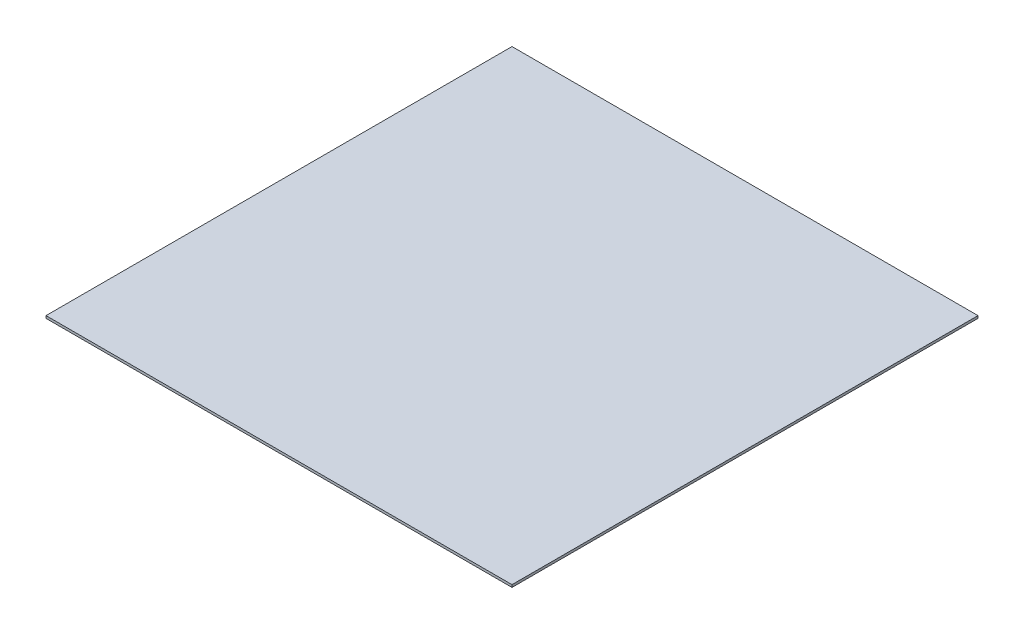
ISO-10303-21;
HEADER;
FILE_DESCRIPTION(('STEP AP214'),'2;1');
FILE_NAME('part.step','',(''),(''),'','','');
FILE_SCHEMA(('AUTOMOTIVE_DESIGN { 1 0 10303 214 1 1 1 1 }'));
ENDSEC;
DATA;
#1=APPLICATION_CONTEXT('core data for automotive mechanical design processes');
#2=APPLICATION_PROTOCOL_DEFINITION('international standard','automotive_design',2000,#1);
#3=PRODUCT_CONTEXT('',#1,'mechanical');
#4=PRODUCT('Part','Part','',(#3));
#5=PRODUCT_RELATED_PRODUCT_CATEGORY('part','',(#4));
#6=PRODUCT_DEFINITION_FORMATION('','',#4);
#7=PRODUCT_DEFINITION_CONTEXT('part definition',#1,'design');
#8=PRODUCT_DEFINITION('design','',#6,#7);
#9=PRODUCT_DEFINITION_SHAPE('','',#8);
#10=(LENGTH_UNIT() NAMED_UNIT(*) SI_UNIT(.MILLI.,.METRE.));
#11=(NAMED_UNIT(*) PLANE_ANGLE_UNIT() SI_UNIT($,.RADIAN.));
#12=(NAMED_UNIT(*) SI_UNIT($,.STERADIAN.) SOLID_ANGLE_UNIT());
#13=UNCERTAINTY_MEASURE_WITH_UNIT(LENGTH_MEASURE(1.E-05),#10,'distance_accuracy_value','');
#14=(GEOMETRIC_REPRESENTATION_CONTEXT(3) GLOBAL_UNCERTAINTY_ASSIGNED_CONTEXT((#13)) GLOBAL_UNIT_ASSIGNED_CONTEXT((#10,
#11,#12)) REPRESENTATION_CONTEXT('',''));
#15=CARTESIAN_POINT('',(0.,0.,0.));
#16=DIRECTION('',(0.,0.,1.));
#17=DIRECTION('',(1.,0.,0.));
#18=AXIS2_PLACEMENT_3D('',#15,#16,#17);
#19=CARTESIAN_POINT('',(0.,6.35,0.));
#20=DIRECTION('',(1.,0.,0.));
#21=DIRECTION('',(0.,0.,-1.));
#22=AXIS2_PLACEMENT_3D('',#19,#20,#21);
#23=PLANE('',#22);
#24=DIRECTION('',(0.,0.,1.));
#25=VECTOR('',#24,1.);
#26=CARTESIAN_POINT('',(0.,0.,0.));
#27=LINE('',#26,#25);
#28=CARTESIAN_POINT('',(0.,0.,-1219.2));
#29=VERTEX_POINT('',#28);
#30=CARTESIAN_POINT('',(0.,0.,0.));
#31=VERTEX_POINT('',#30);
#32=EDGE_CURVE('E98',#29,#31,#27,.T.);
#33=ORIENTED_EDGE('',*,*,#32,.T.);
#34=DIRECTION('',(0.,-1.,0.));
#35=VECTOR('',#34,1.);
#36=CARTESIAN_POINT('',(0.,6.35,0.));
#37=LINE('',#36,#35);
#38=CARTESIAN_POINT('',(0.,6.35,0.));
#39=VERTEX_POINT('',#38);
#40=EDGE_CURVE('E11',#39,#31,#37,.T.);
#41=ORIENTED_EDGE('',*,*,#40,.F.);
#42=DIRECTION('',(0.,0.,1.));
#43=VECTOR('',#42,1.);
#44=CARTESIAN_POINT('',(0.,6.35,0.));
#45=LINE('',#44,#43);
#46=CARTESIAN_POINT('',(0.,6.35,-1219.2));
#47=VERTEX_POINT('',#46);
#48=EDGE_CURVE('E86',#47,#39,#45,.T.);
#49=ORIENTED_EDGE('',*,*,#48,.F.);
#50=DIRECTION('',(0.,-1.,0.));
#51=VECTOR('',#50,1.);
#52=CARTESIAN_POINT('',(0.,6.35,-1219.2));
#53=LINE('',#52,#51);
#54=EDGE_CURVE('E94',#47,#29,#53,.T.);
#55=ORIENTED_EDGE('',*,*,#54,.T.);
#56=EDGE_LOOP('',(#33,#41,#49,#55));
#57=FACE_BOUND('',#56,.T.);
#58=ADVANCED_FACE('F35',(#57),#23,.F.);
#59=CARTESIAN_POINT('',(0.,6.35,0.));
#60=DIRECTION('',(0.,0.,-1.));
#61=DIRECTION('',(-1.,0.,0.));
#62=AXIS2_PLACEMENT_3D('',#59,#60,#61);
#63=PLANE('',#62);
#64=DIRECTION('',(1.,0.,0.));
#65=VECTOR('',#64,1.);
#66=CARTESIAN_POINT('',(0.,0.,0.));
#67=LINE('',#66,#65);
#68=CARTESIAN_POINT('',(1219.2,0.,0.));
#69=VERTEX_POINT('',#68);
#70=EDGE_CURVE('E90',#31,#69,#67,.T.);
#71=ORIENTED_EDGE('',*,*,#70,.T.);
#72=DIRECTION('',(0.,-1.,0.));
#73=VECTOR('',#72,1.);
#74=CARTESIAN_POINT('',(1219.2,6.35,0.));
#75=LINE('',#74,#73);
#76=CARTESIAN_POINT('',(1219.2,6.35,0.));
#77=VERTEX_POINT('',#76);
#78=EDGE_CURVE('E43',#77,#69,#75,.T.);
#79=ORIENTED_EDGE('',*,*,#78,.F.);
#80=DIRECTION('',(1.,0.,0.));
#81=VECTOR('',#80,1.);
#82=CARTESIAN_POINT('',(0.,6.35,0.));
#83=LINE('',#82,#81);
#84=EDGE_CURVE('E81',#39,#77,#83,.T.);
#85=ORIENTED_EDGE('',*,*,#84,.F.);
#86=ORIENTED_EDGE('',*,*,#40,.T.);
#87=EDGE_LOOP('',(#71,#79,#85,#86));
#88=FACE_BOUND('',#87,.T.);
#89=ADVANCED_FACE('F89',(#88),#63,.F.);
#90=CARTESIAN_POINT('',(1219.2,6.35,0.));
#91=DIRECTION('',(-1.,0.,0.));
#92=DIRECTION('',(0.,0.,1.));
#93=AXIS2_PLACEMENT_3D('',#90,#91,#92);
#94=PLANE('',#93);
#95=DIRECTION('',(0.,0.,-1.));
#96=VECTOR('',#95,1.);
#97=CARTESIAN_POINT('',(1219.2,0.,0.));
#98=LINE('',#97,#96);
#99=CARTESIAN_POINT('',(1219.2,0.,-1219.2));
#100=VERTEX_POINT('',#99);
#101=EDGE_CURVE('E68',#69,#100,#98,.T.);
#102=ORIENTED_EDGE('',*,*,#101,.T.);
#103=DIRECTION('',(0.,-1.,0.));
#104=VECTOR('',#103,1.);
#105=CARTESIAN_POINT('',(1219.2,6.35,-1219.2));
#106=LINE('',#105,#104);
#107=CARTESIAN_POINT('',(1219.2,6.35,-1219.2));
#108=VERTEX_POINT('',#107);
#109=EDGE_CURVE('E91',#108,#100,#106,.T.);
#110=ORIENTED_EDGE('',*,*,#109,.F.);
#111=DIRECTION('',(0.,0.,-1.));
#112=VECTOR('',#111,1.);
#113=CARTESIAN_POINT('',(1219.2,6.35,0.));
#114=LINE('',#113,#112);
#115=EDGE_CURVE('E84',#77,#108,#114,.T.);
#116=ORIENTED_EDGE('',*,*,#115,.F.);
#117=ORIENTED_EDGE('',*,*,#78,.T.);
#118=EDGE_LOOP('',(#102,#110,#116,#117));
#119=FACE_BOUND('',#118,.T.);
#120=ADVANCED_FACE('F92',(#119),#94,.F.);
#121=CARTESIAN_POINT('',(0.,6.35,-1219.2));
#122=DIRECTION('',(0.,0.,1.));
#123=DIRECTION('',(1.,0.,0.));
#124=AXIS2_PLACEMENT_3D('',#121,#122,#123);
#125=PLANE('',#124);
#126=DIRECTION('',(-1.,0.,0.));
#127=VECTOR('',#126,1.);
#128=CARTESIAN_POINT('',(0.,0.,-1219.2));
#129=LINE('',#128,#127);
#130=EDGE_CURVE('E74',#100,#29,#129,.T.);
#131=ORIENTED_EDGE('',*,*,#130,.T.);
#132=ORIENTED_EDGE('',*,*,#54,.F.);
#133=DIRECTION('',(-1.,0.,0.));
#134=VECTOR('',#133,1.);
#135=CARTESIAN_POINT('',(0.,6.35,-1219.2));
#136=LINE('',#135,#134);
#137=EDGE_CURVE('E51',#108,#47,#136,.T.);
#138=ORIENTED_EDGE('',*,*,#137,.F.);
#139=ORIENTED_EDGE('',*,*,#109,.T.);
#140=EDGE_LOOP('',(#131,#132,#138,#139));
#141=FACE_BOUND('',#140,.T.);
#142=ADVANCED_FACE('F105',(#141),#125,.F.);
#143=CARTESIAN_POINT('',(0.,6.35,0.));
#144=DIRECTION('',(0.,-1.,0.));
#145=DIRECTION('',(0.,0.,-1.));
#146=AXIS2_PLACEMENT_3D('',#143,#144,#145);
#147=PLANE('',#146);
#148=ORIENTED_EDGE('',*,*,#48,.T.);
#149=ORIENTED_EDGE('',*,*,#84,.T.);
#150=ORIENTED_EDGE('',*,*,#115,.T.);
#151=ORIENTED_EDGE('',*,*,#137,.T.);
#152=EDGE_LOOP('',(#148,#149,#150,#151));
#153=FACE_BOUND('',#152,.T.);
#154=ADVANCED_FACE('F82',(#153),#147,.F.);
#155=CARTESIAN_POINT('',(0.,0.,0.));
#156=DIRECTION('',(0.,-1.,0.));
#157=DIRECTION('',(0.,0.,-1.));
#158=AXIS2_PLACEMENT_3D('',#155,#156,#157);
#159=PLANE('',#158);
#160=ORIENTED_EDGE('',*,*,#32,.F.);
#161=ORIENTED_EDGE('',*,*,#130,.F.);
#162=ORIENTED_EDGE('',*,*,#101,.F.);
#163=ORIENTED_EDGE('',*,*,#70,.F.);
#164=EDGE_LOOP('',(#160,#161,#162,#163));
#165=FACE_BOUND('',#164,.T.);
#166=ADVANCED_FACE('F108',(#165),#159,.T.);
#167=CLOSED_SHELL('',(#58,#89,#120,#142,#154,#166));
#168=MANIFOLD_SOLID_BREP('B2',#167);
#169=ADVANCED_BREP_SHAPE_REPRESENTATION('',(#18,#168),#14);
#170=SHAPE_DEFINITION_REPRESENTATION(#9,#169);
ENDSEC;
END-ISO-10303-21;
